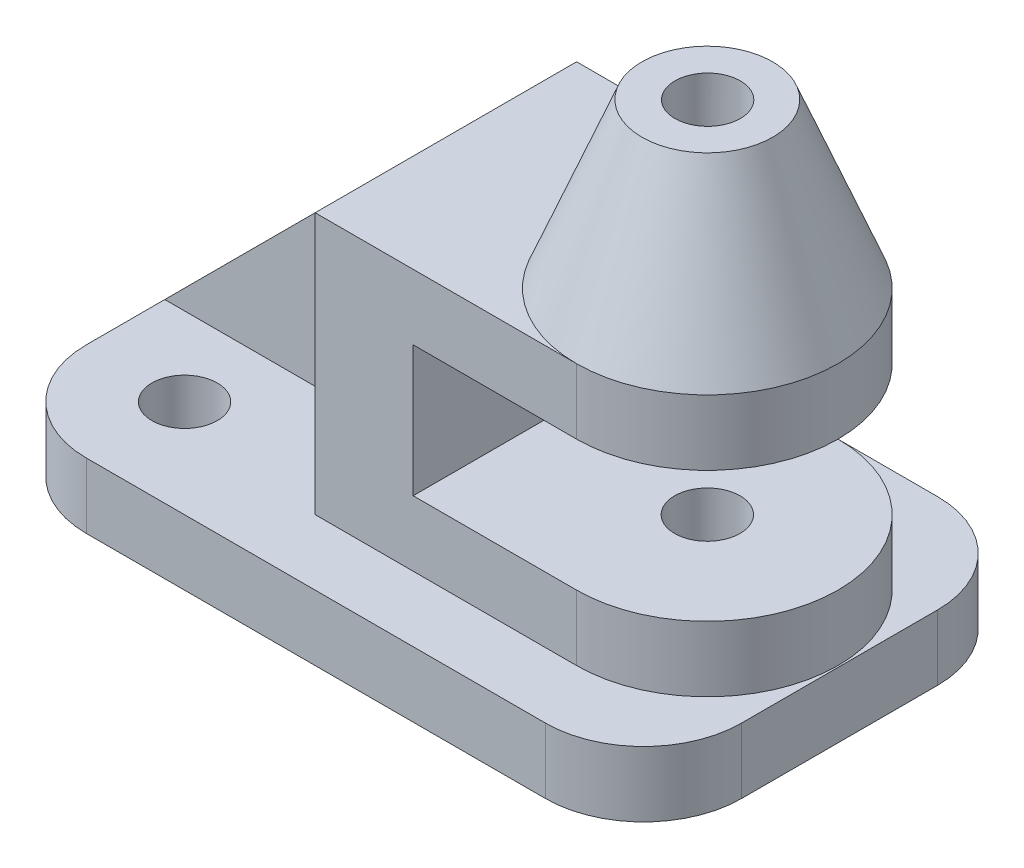
ISO-10303-21;
HEADER;
FILE_DESCRIPTION(('STEP AP214'),'2;1');
FILE_NAME('part.step','',(''),(''),'','','');
FILE_SCHEMA(('AUTOMOTIVE_DESIGN { 1 0 10303 214 1 1 1 1 }'));
ENDSEC;
DATA;
#1=APPLICATION_CONTEXT('core data for automotive mechanical design processes');
#2=APPLICATION_PROTOCOL_DEFINITION('international standard','automotive_design',2000,#1);
#3=PRODUCT_CONTEXT('',#1,'mechanical');
#4=PRODUCT('Part','Part','',(#3));
#5=PRODUCT_RELATED_PRODUCT_CATEGORY('part','',(#4));
#6=PRODUCT_DEFINITION_FORMATION('','',#4);
#7=PRODUCT_DEFINITION_CONTEXT('part definition',#1,'design');
#8=PRODUCT_DEFINITION('design','',#6,#7);
#9=PRODUCT_DEFINITION_SHAPE('','',#8);
#10=(LENGTH_UNIT() NAMED_UNIT(*) SI_UNIT(.MILLI.,.METRE.));
#11=(NAMED_UNIT(*) PLANE_ANGLE_UNIT() SI_UNIT($,.RADIAN.));
#12=(NAMED_UNIT(*) SI_UNIT($,.STERADIAN.) SOLID_ANGLE_UNIT());
#13=UNCERTAINTY_MEASURE_WITH_UNIT(LENGTH_MEASURE(1.E-05),#10,'distance_accuracy_value','');
#14=(GEOMETRIC_REPRESENTATION_CONTEXT(3) GLOBAL_UNCERTAINTY_ASSIGNED_CONTEXT((#13)) GLOBAL_UNIT_ASSIGNED_CONTEXT((#10,
#11,#12)) REPRESENTATION_CONTEXT('',''));
#15=CARTESIAN_POINT('',(0.,0.,0.));
#16=DIRECTION('',(0.,0.,1.));
#17=DIRECTION('',(1.,0.,0.));
#18=AXIS2_PLACEMENT_3D('',#15,#16,#17);
#19=CARTESIAN_POINT('',(-10.1190528471331,50.,20.));
#20=DIRECTION('',(1.,0.,0.));
#21=DIRECTION('',(0.,0.,-1.));
#22=AXIS2_PLACEMENT_3D('',#19,#20,#21);
#23=PLANE('',#22);
#24=DIRECTION('',(0.,-1.,0.));
#25=VECTOR('',#24,1.);
#26=CARTESIAN_POINT('',(-10.1190528471331,50.,-3.));
#27=LINE('',#26,#25);
#28=CARTESIAN_POINT('',(-10.1190528471332,50.,-3.));
#29=VERTEX_POINT('',#28);
#30=CARTESIAN_POINT('',(-10.1190528471331,10.,-3.));
#31=VERTEX_POINT('',#30);
#32=EDGE_CURVE('E353',#29,#31,#27,.T.);
#33=ORIENTED_EDGE('',*,*,#32,.F.);
#34=DIRECTION('',(0.,0.,1.));
#35=VECTOR('',#34,1.);
#36=CARTESIAN_POINT('',(-10.1190528471331,50.,20.));
#37=LINE('',#36,#35);
#38=CARTESIAN_POINT('',(-10.1190528471331,50.,-20.));
#39=VERTEX_POINT('',#38);
#40=EDGE_CURVE('E208',#39,#29,#37,.T.);
#41=ORIENTED_EDGE('',*,*,#40,.F.);
#42=DIRECTION('',(0.,-1.,0.));
#43=VECTOR('',#42,1.);
#44=CARTESIAN_POINT('',(-10.1190528471331,50.,-20.));
#45=LINE('',#44,#43);
#46=CARTESIAN_POINT('',(-10.1190528471331,10.,-20.));
#47=VERTEX_POINT('',#46);
#48=EDGE_CURVE('E239',#39,#47,#45,.T.);
#49=ORIENTED_EDGE('',*,*,#48,.T.);
#50=DIRECTION('',(0.,0.,1.));
#51=VECTOR('',#50,1.);
#52=CARTESIAN_POINT('',(-10.1190528471331,10.,20.));
#53=LINE('',#52,#51);
#54=EDGE_CURVE('E222',#47,#31,#53,.T.);
#55=ORIENTED_EDGE('',*,*,#54,.T.);
#56=EDGE_LOOP('',(#33,#41,#49,#55));
#57=FACE_BOUND('',#56,.T.);
#58=ADVANCED_FACE('F37',(#57),#23,.F.);
#59=CARTESIAN_POINT('',(29.8809471528669,50.,0.));
#60=DIRECTION('',(0.,-1.,0.));
#61=DIRECTION('',(0.,0.,-1.));
#62=AXIS2_PLACEMENT_3D('',#59,#60,#61);
#63=CYLINDRICAL_SURFACE('',#62,20.);
#64=DIRECTION('',(0.,-1.,0.));
#65=VECTOR('',#64,1.);
#66=CARTESIAN_POINT('',(29.8809471528669,50.,20.));
#67=LINE('',#66,#65);
#68=CARTESIAN_POINT('',(29.8809471528669,50.,20.));
#69=VERTEX_POINT('',#68);
#70=CARTESIAN_POINT('',(29.8809471528669,40.,20.));
#71=VERTEX_POINT('',#70);
#72=EDGE_CURVE('E233',#69,#71,#67,.T.);
#73=ORIENTED_EDGE('',*,*,#72,.T.);
#74=CARTESIAN_POINT('',(29.8809471528669,40.,0.));
#75=DIRECTION('',(0.,-1.,0.));
#76=DIRECTION('',(0.,0.,-1.));
#77=AXIS2_PLACEMENT_3D('',#74,#75,#76);
#78=CIRCLE('',#77,20.);
#79=CARTESIAN_POINT('',(29.8809471528669,40.,-20.));
#80=VERTEX_POINT('',#79);
#81=EDGE_CURVE('E315',#80,#71,#78,.T.);
#82=ORIENTED_EDGE('',*,*,#81,.F.);
#83=DIRECTION('',(0.,-1.,0.));
#84=VECTOR('',#83,1.);
#85=CARTESIAN_POINT('',(29.8809471528669,50.,-20.));
#86=LINE('',#85,#84);
#87=CARTESIAN_POINT('',(29.8809471528669,50.,-20.));
#88=VERTEX_POINT('',#87);
#89=EDGE_CURVE('E229',#88,#80,#86,.T.);
#90=ORIENTED_EDGE('',*,*,#89,.F.);
#91=CARTESIAN_POINT('',(29.8809471528669,50.,0.));
#92=DIRECTION('',(0.,1.,0.));
#93=DIRECTION('',(0.,0.,1.));
#94=AXIS2_PLACEMENT_3D('',#91,#92,#93);
#95=CIRCLE('',#94,20.);
#96=EDGE_CURVE('E215',#69,#88,#95,.T.);
#97=ORIENTED_EDGE('',*,*,#96,.F.);
#98=EDGE_LOOP('',(#73,#82,#90,#97));
#99=FACE_BOUND('',#98,.T.);
#100=ADVANCED_FACE('F375',(#99),#63,.T.);
#101=CARTESIAN_POINT('',(29.8809471528668,-9.99999999999999,0.));
#102=DIRECTION('',(0.,1.,0.));
#103=DIRECTION('',(0.,0.,1.));
#104=AXIS2_PLACEMENT_3D('',#101,#102,#103);
#105=CYLINDRICAL_SURFACE('',#104,5.);
#106=CARTESIAN_POINT('',(29.8809471528668,40.,0.));
#107=DIRECTION('',(0.,-1.,0.));
#108=DIRECTION('',(0.,0.,-1.));
#109=AXIS2_PLACEMENT_3D('',#106,#107,#108);
#110=CIRCLE('',#109,5.);
#111=CARTESIAN_POINT('',(29.8809471528668,40.,-5.));
#112=VERTEX_POINT('',#111);
#113=EDGE_CURVE('E313',#112,#112,#110,.F.);
#114=ORIENTED_EDGE('',*,*,#113,.F.);
#115=EDGE_LOOP('',(#114));
#116=FACE_BOUND('',#115,.T.);
#117=CARTESIAN_POINT('',(29.8809471528668,50.,0.));
#118=DIRECTION('',(0.,1.,0.));
#119=DIRECTION('',(0.,0.,1.));
#120=AXIS2_PLACEMENT_3D('',#117,#118,#119);
#121=CIRCLE('',#120,5.);
#122=CARTESIAN_POINT('',(29.9059127762621,50.,4.99993767137636));
#123=VERTEX_POINT('',#122);
#124=CARTESIAN_POINT('',(29.9059127762621,50.,-4.99993767137636));
#125=VERTEX_POINT('',#124);
#126=EDGE_CURVE('E176',#123,#125,#121,.T.);
#127=ORIENTED_EDGE('',*,*,#126,.T.);
#128=EDGE_CURVE('E187',#125,#123,#121,.T.);
#129=ORIENTED_EDGE('',*,*,#128,.T.);
#130=EDGE_LOOP('',(#127,#129));
#131=FACE_BOUND('',#130,.T.);
#132=ADVANCED_FACE('F191',(#116,#131),#105,.F.);
#133=CARTESIAN_POINT('',(-35.1190528471331,10.,-15.));
#134=DIRECTION('',(0.,-1.,0.));
#135=DIRECTION('',(0.,0.,-1.));
#136=AXIS2_PLACEMENT_3D('',#133,#134,#135);
#137=PLANE('',#136);
#138=CARTESIAN_POINT('',(-35.0546536650998,10.,15.0385115163797));
#139=DIRECTION('',(0.,-1.,0.));
#140=DIRECTION('',(0.,0.,-1.));
#141=AXIS2_PLACEMENT_3D('',#138,#139,#140);
#142=CIRCLE('',#141,5.);
#143=CARTESIAN_POINT('',(-35.0546536650998,10.,10.0385115163797));
#144=VERTEX_POINT('',#143);
#145=EDGE_CURVE('E250',#144,#144,#142,.T.);
#146=ORIENTED_EDGE('',*,*,#145,.T.);
#147=EDGE_LOOP('',(#146));
#148=FACE_BOUND('',#147,.T.);
#149=DIRECTION('',(0.,0.,-1.));
#150=VECTOR('',#149,1.);
#151=CARTESIAN_POINT('',(50.1190528471331,10.,15.));
#152=LINE('',#151,#150);
#153=CARTESIAN_POINT('',(50.1190528471331,10.,15.));
#154=VERTEX_POINT('',#153);
#155=CARTESIAN_POINT('',(50.1190528471331,10.,-15.));
#156=VERTEX_POINT('',#155);
#157=EDGE_CURVE('E267',#154,#156,#152,.T.);
#158=ORIENTED_EDGE('',*,*,#157,.T.);
#159=CARTESIAN_POINT('',(35.1190528471331,10.,-15.));
#160=DIRECTION('',(0.,1.,0.));
#161=DIRECTION('',(0.,0.,1.));
#162=AXIS2_PLACEMENT_3D('',#159,#160,#161);
#163=CIRCLE('',#162,15.);
#164=CARTESIAN_POINT('',(35.1190528471331,10.,-30.));
#165=VERTEX_POINT('',#164);
#166=EDGE_CURVE('E265',#156,#165,#163,.T.);
#167=ORIENTED_EDGE('',*,*,#166,.T.);
#168=DIRECTION('',(1.,0.,0.));
#169=VECTOR('',#168,1.);
#170=CARTESIAN_POINT('',(-35.1190528471331,10.,-30.));
#171=LINE('',#170,#169);
#172=CARTESIAN_POINT('',(-35.1190528471331,10.,-30.));
#173=VERTEX_POINT('',#172);
#174=EDGE_CURVE('E262',#173,#165,#171,.T.);
#175=ORIENTED_EDGE('',*,*,#174,.F.);
#176=CARTESIAN_POINT('',(-35.1190528471331,10.,-15.));
#177=DIRECTION('',(0.,-1.,0.));
#178=DIRECTION('',(0.,0.,-1.));
#179=AXIS2_PLACEMENT_3D('',#176,#177,#178);
#180=CIRCLE('',#179,15.);
#181=CARTESIAN_POINT('',(-50.1190528471331,10.,-15.));
#182=VERTEX_POINT('',#181);
#183=EDGE_CURVE('E258',#182,#173,#180,.T.);
#184=ORIENTED_EDGE('',*,*,#183,.F.);
#185=DIRECTION('',(0.,0.,-1.));
#186=VECTOR('',#185,1.);
#187=CARTESIAN_POINT('',(-50.1190528471331,10.,15.));
#188=LINE('',#187,#186);
#189=CARTESIAN_POINT('',(-50.1190528471331,10.,-3.));
#190=VERTEX_POINT('',#189);
#191=EDGE_CURVE('E259',#190,#182,#188,.T.);
#192=ORIENTED_EDGE('',*,*,#191,.F.);
#193=DIRECTION('',(-1.,0.,0.));
#194=VECTOR('',#193,1.);
#195=CARTESIAN_POINT('',(-35.1190528471331,10.,-3.));
#196=LINE('',#195,#194);
#197=EDGE_CURVE('E351',#31,#190,#196,.T.);
#198=ORIENTED_EDGE('',*,*,#197,.F.);
#199=ORIENTED_EDGE('',*,*,#54,.F.);
#200=DIRECTION('',(-1.,0.,0.));
#201=VECTOR('',#200,1.);
#202=CARTESIAN_POINT('',(-10.1190528471331,10.,-20.));
#203=LINE('',#202,#201);
#204=CARTESIAN_POINT('',(29.8809471528669,10.,-20.));
#205=VERTEX_POINT('',#204);
#206=EDGE_CURVE('E202',#205,#47,#203,.T.);
#207=ORIENTED_EDGE('',*,*,#206,.F.);
#208=CARTESIAN_POINT('',(29.8809471528669,10.,0.));
#209=DIRECTION('',(0.,1.,0.));
#210=DIRECTION('',(0.,0.,1.));
#211=AXIS2_PLACEMENT_3D('',#208,#209,#210);
#212=CIRCLE('',#211,20.);
#213=CARTESIAN_POINT('',(29.8809471528669,10.,20.));
#214=VERTEX_POINT('',#213);
#215=EDGE_CURVE('E207',#214,#205,#212,.T.);
#216=ORIENTED_EDGE('',*,*,#215,.F.);
#217=DIRECTION('',(1.,0.,0.));
#218=VECTOR('',#217,1.);
#219=CARTESIAN_POINT('',(-10.1190528471331,10.,20.));
#220=LINE('',#219,#218);
#221=CARTESIAN_POINT('',(-10.1190528471331,10.,20.));
#222=VERTEX_POINT('',#221);
#223=EDGE_CURVE('E225',#222,#214,#220,.T.);
#224=ORIENTED_EDGE('',*,*,#223,.F.);
#225=CARTESIAN_POINT('',(-10.1190528471331,10.,3.));
#226=VERTEX_POINT('',#225);
#227=EDGE_CURVE('E221',#226,#222,#53,.T.);
#228=ORIENTED_EDGE('',*,*,#227,.F.);
#229=DIRECTION('',(-1.,0.,0.));
#230=VECTOR('',#229,1.);
#231=CARTESIAN_POINT('',(-35.1190528471331,10.,3.));
#232=LINE('',#231,#230);
#233=CARTESIAN_POINT('',(-50.1190528471331,10.,3.));
#234=VERTEX_POINT('',#233);
#235=EDGE_CURVE('E345',#226,#234,#232,.T.);
#236=ORIENTED_EDGE('',*,*,#235,.T.);
#237=CARTESIAN_POINT('',(-50.1190528471331,10.,15.));
#238=VERTEX_POINT('',#237);
#239=EDGE_CURVE('E255',#238,#234,#188,.T.);
#240=ORIENTED_EDGE('',*,*,#239,.F.);
#241=CARTESIAN_POINT('',(-35.1190528471331,10.,15.));
#242=DIRECTION('',(0.,-1.,0.));
#243=DIRECTION('',(0.,0.,-1.));
#244=AXIS2_PLACEMENT_3D('',#241,#242,#243);
#245=CIRCLE('',#244,15.);
#246=CARTESIAN_POINT('',(-35.1190528471331,10.,30.));
#247=VERTEX_POINT('',#246);
#248=EDGE_CURVE('E273',#247,#238,#245,.T.);
#249=ORIENTED_EDGE('',*,*,#248,.F.);
#250=DIRECTION('',(1.,0.,0.));
#251=VECTOR('',#250,1.);
#252=CARTESIAN_POINT('',(-35.1190528471331,10.,30.));
#253=LINE('',#252,#251);
#254=CARTESIAN_POINT('',(35.1190528471331,10.,30.));
#255=VERTEX_POINT('',#254);
#256=EDGE_CURVE('E271',#247,#255,#253,.T.);
#257=ORIENTED_EDGE('',*,*,#256,.T.);
#258=CARTESIAN_POINT('',(35.1190528471331,10.,15.));
#259=DIRECTION('',(0.,1.,0.));
#260=DIRECTION('',(0.,0.,1.));
#261=AXIS2_PLACEMENT_3D('',#258,#259,#260);
#262=CIRCLE('',#261,15.);
#263=EDGE_CURVE('E269',#255,#154,#262,.T.);
#264=ORIENTED_EDGE('',*,*,#263,.T.);
#265=EDGE_LOOP('',(#158,#167,#175,#184,#192,#198,#199,#207,#216,#224,#228,#236,#240,#249,#257,#264));
#266=FACE_BOUND('',#265,.T.);
#267=CARTESIAN_POINT('',(-35.0546536650998,10.,-15.0385115163797));
#268=DIRECTION('',(0.,1.,0.));
#269=DIRECTION('',(0.,0.,1.));
#270=AXIS2_PLACEMENT_3D('',#267,#268,#269);
#271=CIRCLE('',#270,5.);
#272=CARTESIAN_POINT('',(-35.0546536650998,10.,-10.0385115163797));
#273=VERTEX_POINT('',#272);
#274=EDGE_CURVE('E247',#273,#273,#271,.T.);
#275=ORIENTED_EDGE('',*,*,#274,.F.);
#276=EDGE_LOOP('',(#275));
#277=FACE_BOUND('',#276,.T.);
#278=ADVANCED_FACE('F396',(#148,#266,#277),#137,.F.);
#279=CARTESIAN_POINT('',(-35.1190528471331,0.,-15.));
#280=DIRECTION('',(0.,-1.,0.));
#281=DIRECTION('',(0.,0.,-1.));
#282=AXIS2_PLACEMENT_3D('',#279,#280,#281);
#283=PLANE('',#282);
#284=CARTESIAN_POINT('',(29.8809471528668,0.,0.));
#285=DIRECTION('',(0.,-1.,0.));
#286=DIRECTION('',(0.,0.,-1.));
#287=AXIS2_PLACEMENT_3D('',#284,#285,#286);
#288=CIRCLE('',#287,5.);
#289=CARTESIAN_POINT('',(29.8809471528668,0.,-5.));
#290=VERTEX_POINT('',#289);
#291=EDGE_CURVE('E199',#290,#290,#288,.T.);
#292=ORIENTED_EDGE('',*,*,#291,.F.);
#293=EDGE_LOOP('',(#292));
#294=FACE_BOUND('',#293,.T.);
#295=CARTESIAN_POINT('',(35.1190528471331,0.,-15.));
#296=DIRECTION('',(0.,1.,0.));
#297=DIRECTION('',(0.,0.,1.));
#298=AXIS2_PLACEMENT_3D('',#295,#296,#297);
#299=CIRCLE('',#298,15.);
#300=CARTESIAN_POINT('',(50.1190528471331,0.,-15.));
#301=VERTEX_POINT('',#300);
#302=CARTESIAN_POINT('',(35.1190528471331,0.,-30.));
#303=VERTEX_POINT('',#302);
#304=EDGE_CURVE('E284',#301,#303,#299,.T.);
#305=ORIENTED_EDGE('',*,*,#304,.F.);
#306=DIRECTION('',(0.,0.,-1.));
#307=VECTOR('',#306,1.);
#308=CARTESIAN_POINT('',(50.1190528471331,0.,15.));
#309=LINE('',#308,#307);
#310=CARTESIAN_POINT('',(50.1190528471331,0.,15.));
#311=VERTEX_POINT('',#310);
#312=EDGE_CURVE('E287',#311,#301,#309,.T.);
#313=ORIENTED_EDGE('',*,*,#312,.F.);
#314=CARTESIAN_POINT('',(35.1190528471331,0.,15.));
#315=DIRECTION('',(0.,1.,0.));
#316=DIRECTION('',(0.,0.,1.));
#317=AXIS2_PLACEMENT_3D('',#314,#315,#316);
#318=CIRCLE('',#317,15.);
#319=CARTESIAN_POINT('',(35.1190528471331,0.,30.));
#320=VERTEX_POINT('',#319);
#321=EDGE_CURVE('E289',#320,#311,#318,.T.);
#322=ORIENTED_EDGE('',*,*,#321,.F.);
#323=DIRECTION('',(1.,0.,0.));
#324=VECTOR('',#323,1.);
#325=CARTESIAN_POINT('',(-35.1190528471331,0.,30.));
#326=LINE('',#325,#324);
#327=CARTESIAN_POINT('',(-35.1190528471331,0.,30.));
#328=VERTEX_POINT('',#327);
#329=EDGE_CURVE('E291',#328,#320,#326,.T.);
#330=ORIENTED_EDGE('',*,*,#329,.F.);
#331=CARTESIAN_POINT('',(-35.1190528471331,0.,15.));
#332=DIRECTION('',(0.,-1.,0.));
#333=DIRECTION('',(0.,0.,-1.));
#334=AXIS2_PLACEMENT_3D('',#331,#332,#333);
#335=CIRCLE('',#334,15.);
#336=CARTESIAN_POINT('',(-50.1190528471331,0.,15.));
#337=VERTEX_POINT('',#336);
#338=EDGE_CURVE('E293',#328,#337,#335,.T.);
#339=ORIENTED_EDGE('',*,*,#338,.T.);
#340=DIRECTION('',(0.,0.,-1.));
#341=VECTOR('',#340,1.);
#342=CARTESIAN_POINT('',(-50.1190528471331,0.,15.));
#343=LINE('',#342,#341);
#344=CARTESIAN_POINT('',(-50.1190528471331,0.,-15.));
#345=VERTEX_POINT('',#344);
#346=EDGE_CURVE('E246',#337,#345,#343,.T.);
#347=ORIENTED_EDGE('',*,*,#346,.T.);
#348=CARTESIAN_POINT('',(-35.1190528471331,0.,-15.));
#349=DIRECTION('',(0.,-1.,0.));
#350=DIRECTION('',(0.,0.,-1.));
#351=AXIS2_PLACEMENT_3D('',#348,#349,#350);
#352=CIRCLE('',#351,15.);
#353=CARTESIAN_POINT('',(-35.1190528471331,0.,-30.));
#354=VERTEX_POINT('',#353);
#355=EDGE_CURVE('E278',#345,#354,#352,.T.);
#356=ORIENTED_EDGE('',*,*,#355,.T.);
#357=DIRECTION('',(1.,0.,0.));
#358=VECTOR('',#357,1.);
#359=CARTESIAN_POINT('',(-35.1190528471331,0.,-30.));
#360=LINE('',#359,#358);
#361=EDGE_CURVE('E281',#354,#303,#360,.T.);
#362=ORIENTED_EDGE('',*,*,#361,.T.);
#363=EDGE_LOOP('',(#305,#313,#322,#330,#339,#347,#356,#362));
#364=FACE_BOUND('',#363,.T.);
#365=CARTESIAN_POINT('',(-35.0546536650998,0.,15.0385115163797));
#366=DIRECTION('',(0.,-1.,0.));
#367=DIRECTION('',(0.,0.,-1.));
#368=AXIS2_PLACEMENT_3D('',#365,#366,#367);
#369=CIRCLE('',#368,5.);
#370=CARTESIAN_POINT('',(-35.0546536650998,0.,10.0385115163797));
#371=VERTEX_POINT('',#370);
#372=EDGE_CURVE('E242',#371,#371,#369,.T.);
#373=ORIENTED_EDGE('',*,*,#372,.F.);
#374=EDGE_LOOP('',(#373));
#375=FACE_BOUND('',#374,.T.);
#376=CARTESIAN_POINT('',(-35.0546536650998,0.,-15.0385115163797));
#377=DIRECTION('',(0.,1.,0.));
#378=DIRECTION('',(0.,0.,1.));
#379=AXIS2_PLACEMENT_3D('',#376,#377,#378);
#380=CIRCLE('',#379,5.);
#381=CARTESIAN_POINT('',(-35.0546536650998,0.,-10.0385115163797));
#382=VERTEX_POINT('',#381);
#383=EDGE_CURVE('E243',#382,#382,#380,.T.);
#384=ORIENTED_EDGE('',*,*,#383,.T.);
#385=EDGE_LOOP('',(#384));
#386=FACE_BOUND('',#385,.T.);
#387=ADVANCED_FACE('F454',(#294,#364,#375,#386),#283,.T.);
#388=CARTESIAN_POINT('',(-50.1190528471331,10.,15.));
#389=DIRECTION('',(-1.,0.,0.));
#390=DIRECTION('',(0.,0.,1.));
#391=AXIS2_PLACEMENT_3D('',#388,#389,#390);
#392=PLANE('',#391);
#393=ORIENTED_EDGE('',*,*,#239,.T.);
#394=DIRECTION('',(0.,0.,1.));
#395=VECTOR('',#394,1.);
#396=CARTESIAN_POINT('',(-50.1190528471331,10.,15.));
#397=LINE('',#396,#395);
#398=EDGE_CURVE('E336',#234,#190,#397,.F.);
#399=ORIENTED_EDGE('',*,*,#398,.T.);
#400=ORIENTED_EDGE('',*,*,#191,.T.);
#401=DIRECTION('',(0.,-1.,0.));
#402=VECTOR('',#401,1.);
#403=CARTESIAN_POINT('',(-50.1190528471331,10.,-15.));
#404=LINE('',#403,#402);
#405=EDGE_CURVE('E276',#182,#345,#404,.T.);
#406=ORIENTED_EDGE('',*,*,#405,.T.);
#407=ORIENTED_EDGE('',*,*,#346,.F.);
#408=DIRECTION('',(0.,-1.,0.));
#409=VECTOR('',#408,1.);
#410=CARTESIAN_POINT('',(-50.1190528471331,10.,15.));
#411=LINE('',#410,#409);
#412=EDGE_CURVE('E46',#238,#337,#411,.T.);
#413=ORIENTED_EDGE('',*,*,#412,.F.);
#414=EDGE_LOOP('',(#393,#399,#400,#406,#407,#413));
#415=FACE_BOUND('',#414,.T.);
#416=ADVANCED_FACE('F39',(#415),#392,.T.);
#417=CARTESIAN_POINT('',(-35.1190528471331,10.,15.));
#418=DIRECTION('',(0.,-1.,0.));
#419=DIRECTION('',(0.,0.,-1.));
#420=AXIS2_PLACEMENT_3D('',#417,#418,#419);
#421=CYLINDRICAL_SURFACE('',#420,15.);
#422=ORIENTED_EDGE('',*,*,#338,.F.);
#423=DIRECTION('',(0.,-1.,0.));
#424=VECTOR('',#423,1.);
#425=CARTESIAN_POINT('',(-35.1190528471331,10.,30.));
#426=LINE('',#425,#424);
#427=EDGE_CURVE('E297',#247,#328,#426,.T.);
#428=ORIENTED_EDGE('',*,*,#427,.F.);
#429=ORIENTED_EDGE('',*,*,#248,.T.);
#430=ORIENTED_EDGE('',*,*,#412,.T.);
#431=EDGE_LOOP('',(#422,#428,#429,#430));
#432=FACE_BOUND('',#431,.T.);
#433=ADVANCED_FACE('F459',(#432),#421,.T.);
#434=CARTESIAN_POINT('',(-35.1190528471331,10.,30.));
#435=DIRECTION('',(0.,0.,-1.));
#436=DIRECTION('',(-1.,0.,0.));
#437=AXIS2_PLACEMENT_3D('',#434,#435,#436);
#438=PLANE('',#437);
#439=ORIENTED_EDGE('',*,*,#329,.T.);
#440=DIRECTION('',(0.,-1.,0.));
#441=VECTOR('',#440,1.);
#442=CARTESIAN_POINT('',(35.1190528471331,10.,30.));
#443=LINE('',#442,#441);
#444=EDGE_CURVE('E299',#255,#320,#443,.T.);
#445=ORIENTED_EDGE('',*,*,#444,.F.);
#446=ORIENTED_EDGE('',*,*,#256,.F.);
#447=ORIENTED_EDGE('',*,*,#427,.T.);
#448=EDGE_LOOP('',(#439,#445,#446,#447));
#449=FACE_BOUND('',#448,.T.);
#450=ADVANCED_FACE('F462',(#449),#438,.F.);
#451=CARTESIAN_POINT('',(35.1190528471331,10.,15.));
#452=DIRECTION('',(0.,-1.,0.));
#453=DIRECTION('',(0.,0.,-1.));
#454=AXIS2_PLACEMENT_3D('',#451,#452,#453);
#455=CYLINDRICAL_SURFACE('',#454,15.);
#456=ORIENTED_EDGE('',*,*,#321,.T.);
#457=DIRECTION('',(0.,-1.,0.));
#458=VECTOR('',#457,1.);
#459=CARTESIAN_POINT('',(50.1190528471331,10.,15.));
#460=LINE('',#459,#458);
#461=EDGE_CURVE('E302',#154,#311,#460,.T.);
#462=ORIENTED_EDGE('',*,*,#461,.F.);
#463=ORIENTED_EDGE('',*,*,#263,.F.);
#464=ORIENTED_EDGE('',*,*,#444,.T.);
#465=EDGE_LOOP('',(#456,#462,#463,#464));
#466=FACE_BOUND('',#465,.T.);
#467=ADVANCED_FACE('F466',(#466),#455,.T.);
#468=CARTESIAN_POINT('',(50.1190528471331,10.,15.));
#469=DIRECTION('',(-1.,0.,0.));
#470=DIRECTION('',(0.,0.,1.));
#471=AXIS2_PLACEMENT_3D('',#468,#469,#470);
#472=PLANE('',#471);
#473=ORIENTED_EDGE('',*,*,#312,.T.);
#474=DIRECTION('',(0.,-1.,0.));
#475=VECTOR('',#474,1.);
#476=CARTESIAN_POINT('',(50.1190528471331,10.,-15.));
#477=LINE('',#476,#475);
#478=EDGE_CURVE('E305',#156,#301,#477,.T.);
#479=ORIENTED_EDGE('',*,*,#478,.F.);
#480=ORIENTED_EDGE('',*,*,#157,.F.);
#481=ORIENTED_EDGE('',*,*,#461,.T.);
#482=EDGE_LOOP('',(#473,#479,#480,#481));
#483=FACE_BOUND('',#482,.T.);
#484=ADVANCED_FACE('F470',(#483),#472,.F.);
#485=CARTESIAN_POINT('',(35.1190528471331,10.,-15.));
#486=DIRECTION('',(0.,-1.,0.));
#487=DIRECTION('',(0.,0.,-1.));
#488=AXIS2_PLACEMENT_3D('',#485,#486,#487);
#489=CYLINDRICAL_SURFACE('',#488,15.);
#490=ORIENTED_EDGE('',*,*,#304,.T.);
#491=DIRECTION('',(0.,-1.,0.));
#492=VECTOR('',#491,1.);
#493=CARTESIAN_POINT('',(35.1190528471331,10.,-30.));
#494=LINE('',#493,#492);
#495=EDGE_CURVE('E308',#165,#303,#494,.T.);
#496=ORIENTED_EDGE('',*,*,#495,.F.);
#497=ORIENTED_EDGE('',*,*,#166,.F.);
#498=ORIENTED_EDGE('',*,*,#478,.T.);
#499=EDGE_LOOP('',(#490,#496,#497,#498));
#500=FACE_BOUND('',#499,.T.);
#501=ADVANCED_FACE('F474',(#500),#489,.T.);
#502=CARTESIAN_POINT('',(-35.1190528471331,10.,-30.));
#503=DIRECTION('',(0.,0.,-1.));
#504=DIRECTION('',(-1.,0.,0.));
#505=AXIS2_PLACEMENT_3D('',#502,#503,#504);
#506=PLANE('',#505);
#507=ORIENTED_EDGE('',*,*,#361,.F.);
#508=DIRECTION('',(0.,-1.,0.));
#509=VECTOR('',#508,1.);
#510=CARTESIAN_POINT('',(-35.1190528471331,10.,-30.));
#511=LINE('',#510,#509);
#512=EDGE_CURVE('E310',#173,#354,#511,.T.);
#513=ORIENTED_EDGE('',*,*,#512,.F.);
#514=ORIENTED_EDGE('',*,*,#174,.T.);
#515=ORIENTED_EDGE('',*,*,#495,.T.);
#516=EDGE_LOOP('',(#507,#513,#514,#515));
#517=FACE_BOUND('',#516,.T.);
#518=ADVANCED_FACE('F478',(#517),#506,.T.);
#519=CARTESIAN_POINT('',(-35.1190528471331,10.,-15.));
#520=DIRECTION('',(0.,-1.,0.));
#521=DIRECTION('',(0.,0.,-1.));
#522=AXIS2_PLACEMENT_3D('',#519,#520,#521);
#523=CYLINDRICAL_SURFACE('',#522,15.);
#524=ORIENTED_EDGE('',*,*,#355,.F.);
#525=ORIENTED_EDGE('',*,*,#405,.F.);
#526=ORIENTED_EDGE('',*,*,#183,.T.);
#527=ORIENTED_EDGE('',*,*,#512,.T.);
#528=EDGE_LOOP('',(#524,#525,#526,#527));
#529=FACE_BOUND('',#528,.T.);
#530=ADVANCED_FACE('F450',(#529),#523,.T.);
#531=CARTESIAN_POINT('',(-35.0546536650998,0.,15.0385115163797));
#532=DIRECTION('',(0.,1.,0.));
#533=DIRECTION('',(0.,0.,1.));
#534=AXIS2_PLACEMENT_3D('',#531,#532,#533);
#535=CYLINDRICAL_SURFACE('',#534,5.);
#536=ORIENTED_EDGE('',*,*,#372,.T.);
#537=EDGE_LOOP('',(#536));
#538=FACE_BOUND('',#537,.T.);
#539=ORIENTED_EDGE('',*,*,#145,.F.);
#540=EDGE_LOOP('',(#539));
#541=FACE_BOUND('',#540,.T.);
#542=ADVANCED_FACE('F444',(#538,#541),#535,.F.);
#543=CARTESIAN_POINT('',(-35.0546536650998,0.,-15.0385115163797));
#544=DIRECTION('',(0.,1.,0.));
#545=DIRECTION('',(0.,0.,1.));
#546=AXIS2_PLACEMENT_3D('',#543,#544,#545);
#547=CYLINDRICAL_SURFACE('',#546,5.);
#548=ORIENTED_EDGE('',*,*,#383,.F.);
#549=EDGE_LOOP('',(#548));
#550=FACE_BOUND('',#549,.T.);
#551=ORIENTED_EDGE('',*,*,#274,.T.);
#552=EDGE_LOOP('',(#551));
#553=FACE_BOUND('',#552,.T.);
#554=ADVANCED_FACE('F440',(#550,#553),#547,.F.);
#555=CARTESIAN_POINT('',(-10.1190528471331,50.,-20.));
#556=DIRECTION('',(0.,0.,1.));
#557=DIRECTION('',(1.,0.,0.));
#558=AXIS2_PLACEMENT_3D('',#555,#556,#557);
#559=PLANE('',#558);
#560=DIRECTION('',(0.,-1.,0.));
#561=VECTOR('',#560,1.);
#562=CARTESIAN_POINT('',(4.88094715286686,40.,-20.));
#563=LINE('',#562,#561);
#564=CARTESIAN_POINT('',(4.88094715286686,40.,-20.));
#565=VERTEX_POINT('',#564);
#566=CARTESIAN_POINT('',(4.88094715286686,20.,-20.));
#567=VERTEX_POINT('',#566);
#568=EDGE_CURVE('E325',#565,#567,#563,.T.);
#569=ORIENTED_EDGE('',*,*,#568,.T.);
#570=DIRECTION('',(1.,0.,0.));
#571=VECTOR('',#570,1.);
#572=CARTESIAN_POINT('',(4.88094715286686,20.,-20.));
#573=LINE('',#572,#571);
#574=CARTESIAN_POINT('',(29.8809471528669,20.,-20.));
#575=VERTEX_POINT('',#574);
#576=EDGE_CURVE('E330',#567,#575,#573,.T.);
#577=ORIENTED_EDGE('',*,*,#576,.T.);
#578=EDGE_CURVE('E218',#575,#205,#86,.T.);
#579=ORIENTED_EDGE('',*,*,#578,.T.);
#580=ORIENTED_EDGE('',*,*,#206,.T.);
#581=ORIENTED_EDGE('',*,*,#48,.F.);
#582=DIRECTION('',(-1.,0.,0.));
#583=VECTOR('',#582,1.);
#584=CARTESIAN_POINT('',(-10.1190528471331,50.,-20.));
#585=LINE('',#584,#583);
#586=EDGE_CURVE('E203',#88,#39,#585,.T.);
#587=ORIENTED_EDGE('',*,*,#586,.F.);
#588=ORIENTED_EDGE('',*,*,#89,.T.);
#589=DIRECTION('',(1.,0.,0.));
#590=VECTOR('',#589,1.);
#591=CARTESIAN_POINT('',(4.88094715286686,40.,-20.));
#592=LINE('',#591,#590);
#593=EDGE_CURVE('E339',#565,#80,#592,.T.);
#594=ORIENTED_EDGE('',*,*,#593,.F.);
#595=EDGE_LOOP('',(#569,#577,#579,#580,#581,#587,#588,#594));
#596=FACE_BOUND('',#595,.T.);
#597=ADVANCED_FACE('F404',(#596),#559,.F.);
#598=CARTESIAN_POINT('',(-10.1190528471331,50.,3.));
#599=VERTEX_POINT('',#598);
#600=CARTESIAN_POINT('',(-10.1190528471331,50.,20.));
#601=VERTEX_POINT('',#600);
#602=EDGE_CURVE('E206',#599,#601,#37,.T.);
#603=ORIENTED_EDGE('',*,*,#602,.F.);
#604=DIRECTION('',(0.,-1.,0.));
#605=VECTOR('',#604,1.);
#606=CARTESIAN_POINT('',(-10.1190528471331,50.,3.));
#607=LINE('',#606,#605);
#608=EDGE_CURVE('E348',#599,#226,#607,.T.);
#609=ORIENTED_EDGE('',*,*,#608,.T.);
#610=ORIENTED_EDGE('',*,*,#227,.T.);
#611=DIRECTION('',(0.,-1.,0.));
#612=VECTOR('',#611,1.);
#613=CARTESIAN_POINT('',(-10.1190528471331,50.,20.));
#614=LINE('',#613,#612);
#615=EDGE_CURVE('E236',#601,#222,#614,.T.);
#616=ORIENTED_EDGE('',*,*,#615,.F.);
#617=EDGE_LOOP('',(#603,#609,#610,#616));
#618=FACE_BOUND('',#617,.T.);
#619=ADVANCED_FACE('F390',(#618),#23,.F.);
#620=CARTESIAN_POINT('',(-10.1190528471331,50.,20.));
#621=DIRECTION('',(0.,0.,-1.));
#622=DIRECTION('',(-1.,0.,0.));
#623=AXIS2_PLACEMENT_3D('',#620,#621,#622);
#624=PLANE('',#623);
#625=CARTESIAN_POINT('',(29.8809471528669,20.,20.));
#626=VERTEX_POINT('',#625);
#627=EDGE_CURVE('E232',#626,#214,#67,.T.);
#628=ORIENTED_EDGE('',*,*,#627,.F.);
#629=DIRECTION('',(1.,0.,0.));
#630=VECTOR('',#629,1.);
#631=CARTESIAN_POINT('',(4.88094715286686,20.,20.));
#632=LINE('',#631,#630);
#633=CARTESIAN_POINT('',(4.88094715286686,20.,20.));
#634=VERTEX_POINT('',#633);
#635=EDGE_CURVE('E334',#634,#626,#632,.T.);
#636=ORIENTED_EDGE('',*,*,#635,.F.);
#637=DIRECTION('',(0.,-1.,0.));
#638=VECTOR('',#637,1.);
#639=CARTESIAN_POINT('',(4.88094715286686,40.,20.));
#640=LINE('',#639,#638);
#641=CARTESIAN_POINT('',(4.88094715286686,40.,20.));
#642=VERTEX_POINT('',#641);
#643=EDGE_CURVE('E328',#642,#634,#640,.T.);
#644=ORIENTED_EDGE('',*,*,#643,.F.);
#645=DIRECTION('',(1.,0.,0.));
#646=VECTOR('',#645,1.);
#647=CARTESIAN_POINT('',(4.88094715286686,40.,20.));
#648=LINE('',#647,#646);
#649=EDGE_CURVE('E331',#642,#71,#648,.T.);
#650=ORIENTED_EDGE('',*,*,#649,.T.);
#651=ORIENTED_EDGE('',*,*,#72,.F.);
#652=DIRECTION('',(1.,0.,0.));
#653=VECTOR('',#652,1.);
#654=CARTESIAN_POINT('',(-10.1190528471331,50.,20.));
#655=LINE('',#654,#653);
#656=EDGE_CURVE('E211',#601,#69,#655,.T.);
#657=ORIENTED_EDGE('',*,*,#656,.F.);
#658=ORIENTED_EDGE('',*,*,#615,.T.);
#659=ORIENTED_EDGE('',*,*,#223,.T.);
#660=EDGE_LOOP('',(#628,#636,#644,#650,#651,#657,#658,#659));
#661=FACE_BOUND('',#660,.T.);
#662=ADVANCED_FACE('F381',(#661),#624,.F.);
#663=ORIENTED_EDGE('',*,*,#215,.T.);
#664=ORIENTED_EDGE('',*,*,#578,.F.);
#665=CARTESIAN_POINT('',(29.8809471528669,20.,0.));
#666=DIRECTION('',(0.,-1.,0.));
#667=DIRECTION('',(0.,0.,-1.));
#668=AXIS2_PLACEMENT_3D('',#665,#666,#667);
#669=CIRCLE('',#668,20.);
#670=EDGE_CURVE('E197',#575,#626,#669,.T.);
#671=ORIENTED_EDGE('',*,*,#670,.T.);
#672=ORIENTED_EDGE('',*,*,#627,.T.);
#673=EDGE_LOOP('',(#663,#664,#671,#672));
#674=FACE_BOUND('',#673,.T.);
#675=ADVANCED_FACE('F402',(#674),#63,.T.);
#676=CARTESIAN_POINT('',(29.8809471528669,50.,0.));
#677=DIRECTION('',(0.,1.,0.));
#678=DIRECTION('',(0.,0.,1.));
#679=AXIS2_PLACEMENT_3D('',#676,#677,#678);
#680=PLANE('',#679);
#681=CARTESIAN_POINT('',(29.8809471528669,50.,0.));
#682=DIRECTION('',(0.,1.,0.));
#683=DIRECTION('',(0.,0.,1.));
#684=AXIS2_PLACEMENT_3D('',#681,#682,#683);
#685=CIRCLE('',#684,20.);
#686=EDGE_CURVE('E11',#88,#69,#685,.T.);
#687=ORIENTED_EDGE('',*,*,#686,.F.);
#688=ORIENTED_EDGE('',*,*,#586,.T.);
#689=ORIENTED_EDGE('',*,*,#40,.T.);
#690=EDGE_CURVE('E212',#29,#599,#37,.T.);
#691=ORIENTED_EDGE('',*,*,#690,.T.);
#692=ORIENTED_EDGE('',*,*,#602,.T.);
#693=ORIENTED_EDGE('',*,*,#656,.T.);
#694=EDGE_LOOP('',(#687,#688,#689,#691,#692,#693));
#695=FACE_BOUND('',#694,.T.);
#696=ADVANCED_FACE('F385',(#695),#680,.T.);
#697=ORIENTED_EDGE('',*,*,#291,.T.);
#698=EDGE_LOOP('',(#697));
#699=FACE_BOUND('',#698,.T.);
#700=CARTESIAN_POINT('',(29.8809471528668,20.,0.));
#701=DIRECTION('',(0.,-1.,0.));
#702=DIRECTION('',(0.,0.,-1.));
#703=AXIS2_PLACEMENT_3D('',#700,#701,#702);
#704=CIRCLE('',#703,5.);
#705=CARTESIAN_POINT('',(29.8809471528668,20.,-5.));
#706=VERTEX_POINT('',#705);
#707=EDGE_CURVE('E41',#706,#706,#704,.F.);
#708=ORIENTED_EDGE('',*,*,#707,.T.);
#709=EDGE_LOOP('',(#708));
#710=FACE_BOUND('',#709,.T.);
#711=ADVANCED_FACE('F412',(#699,#710),#105,.F.);
#712=CARTESIAN_POINT('',(4.88094715286686,20.,-20.));
#713=DIRECTION('',(0.,-1.,0.));
#714=DIRECTION('',(0.,0.,-1.));
#715=AXIS2_PLACEMENT_3D('',#712,#713,#714);
#716=PLANE('',#715);
#717=ORIENTED_EDGE('',*,*,#707,.F.);
#718=EDGE_LOOP('',(#717));
#719=FACE_BOUND('',#718,.T.);
#720=ORIENTED_EDGE('',*,*,#635,.T.);
#721=ORIENTED_EDGE('',*,*,#670,.F.);
#722=ORIENTED_EDGE('',*,*,#576,.F.);
#723=DIRECTION('',(0.,0.,1.));
#724=VECTOR('',#723,1.);
#725=CARTESIAN_POINT('',(4.88094715286686,20.,-20.));
#726=LINE('',#725,#724);
#727=EDGE_CURVE('E316',#567,#634,#726,.T.);
#728=ORIENTED_EDGE('',*,*,#727,.T.);
#729=EDGE_LOOP('',(#720,#721,#722,#728));
#730=FACE_BOUND('',#729,.T.);
#731=ADVANCED_FACE('F408',(#719,#730),#716,.F.);
#732=CARTESIAN_POINT('',(4.88094715286686,40.,-20.));
#733=DIRECTION('',(0.,-1.,0.));
#734=DIRECTION('',(0.,0.,-1.));
#735=AXIS2_PLACEMENT_3D('',#732,#733,#734);
#736=PLANE('',#735);
#737=ORIENTED_EDGE('',*,*,#113,.T.);
#738=EDGE_LOOP('',(#737));
#739=FACE_BOUND('',#738,.T.);
#740=ORIENTED_EDGE('',*,*,#81,.T.);
#741=ORIENTED_EDGE('',*,*,#649,.F.);
#742=DIRECTION('',(0.,0.,1.));
#743=VECTOR('',#742,1.);
#744=CARTESIAN_POINT('',(4.88094715286686,40.,-20.));
#745=LINE('',#744,#743);
#746=EDGE_CURVE('E319',#565,#642,#745,.T.);
#747=ORIENTED_EDGE('',*,*,#746,.F.);
#748=ORIENTED_EDGE('',*,*,#593,.T.);
#749=EDGE_LOOP('',(#740,#741,#747,#748));
#750=FACE_BOUND('',#749,.T.);
#751=ADVANCED_FACE('F415',(#739,#750),#736,.T.);
#752=CARTESIAN_POINT('',(4.88094715286686,40.,-20.));
#753=DIRECTION('',(-1.,0.,0.));
#754=DIRECTION('',(0.,-1.,0.));
#755=AXIS2_PLACEMENT_3D('',#752,#753,#754);
#756=PLANE('',#755);
#757=ORIENTED_EDGE('',*,*,#643,.T.);
#758=ORIENTED_EDGE('',*,*,#727,.F.);
#759=ORIENTED_EDGE('',*,*,#568,.F.);
#760=ORIENTED_EDGE('',*,*,#746,.T.);
#761=EDGE_LOOP('',(#757,#758,#759,#760));
#762=FACE_BOUND('',#761,.T.);
#763=ADVANCED_FACE('F421',(#762),#756,.F.);
#764=CARTESIAN_POINT('',(-50.1190528471331,10.,0.));
#765=DIRECTION('',(0.707106781186548,-0.707106781186548,0.));
#766=DIRECTION('',(0.707106781186548,0.707106781186548,0.));
#767=AXIS2_PLACEMENT_3D('',#764,#765,#766);
#768=PLANE('',#767);
#769=ORIENTED_EDGE('',*,*,#398,.F.);
#770=DIRECTION('',(0.707106781186548,0.707106781186548,0.));
#771=VECTOR('',#770,1.);
#772=CARTESIAN_POINT('',(-50.1190528471331,10.,3.));
#773=LINE('',#772,#771);
#774=EDGE_CURVE('E61',#234,#599,#773,.T.);
#775=ORIENTED_EDGE('',*,*,#774,.T.);
#776=ORIENTED_EDGE('',*,*,#690,.F.);
#777=DIRECTION('',(0.707106781186548,0.707106781186548,0.));
#778=VECTOR('',#777,1.);
#779=CARTESIAN_POINT('',(-50.1190528471331,10.,-3.));
#780=LINE('',#779,#778);
#781=EDGE_CURVE('E192',#190,#29,#780,.T.);
#782=ORIENTED_EDGE('',*,*,#781,.F.);
#783=EDGE_LOOP('',(#769,#775,#776,#782));
#784=FACE_BOUND('',#783,.T.);
#785=ADVANCED_FACE('F515',(#784),#768,.F.);
#786=CARTESIAN_POINT('',(0.,25.,3.));
#787=DIRECTION('',(0.,0.,1.));
#788=DIRECTION('',(1.,0.,0.));
#789=AXIS2_PLACEMENT_3D('',#786,#787,#788);
#790=PLANE('',#789);
#791=ORIENTED_EDGE('',*,*,#235,.F.);
#792=ORIENTED_EDGE('',*,*,#608,.F.);
#793=ORIENTED_EDGE('',*,*,#774,.F.);
#794=EDGE_LOOP('',(#791,#792,#793));
#795=FACE_BOUND('',#794,.T.);
#796=ADVANCED_FACE('F513',(#795),#790,.T.);
#797=CARTESIAN_POINT('',(0.,25.,-3.));
#798=DIRECTION('',(0.,0.,1.));
#799=DIRECTION('',(1.,0.,0.));
#800=AXIS2_PLACEMENT_3D('',#797,#798,#799);
#801=PLANE('',#800);
#802=ORIENTED_EDGE('',*,*,#32,.T.);
#803=ORIENTED_EDGE('',*,*,#197,.T.);
#804=ORIENTED_EDGE('',*,*,#781,.T.);
#805=EDGE_LOOP('',(#802,#803,#804));
#806=FACE_BOUND('',#805,.T.);
#807=ADVANCED_FACE('F365',(#806),#801,.F.);
#808=CARTESIAN_POINT('',(29.8809471528669,75.,0.));
#809=DIRECTION('',(0.,1.,0.));
#810=DIRECTION('',(0.,0.,1.));
#811=AXIS2_PLACEMENT_3D('',#808,#809,#810);
#812=PLANE('',#811);
#813=CARTESIAN_POINT('',(29.9308783996578,75.,0.));
#814=DIRECTION('',(0.,1.,0.));
#815=DIRECTION('',(0.,0.,1.));
#816=AXIS2_PLACEMENT_3D('',#813,#814,#815);
#817=CIRCLE('',#816,5.);
#818=CARTESIAN_POINT('',(29.9308783996578,75.,5.));
#819=VERTEX_POINT('',#818);
#820=EDGE_CURVE('E179',#819,#819,#817,.T.);
#821=ORIENTED_EDGE('',*,*,#820,.F.);
#822=EDGE_LOOP('',(#821));
#823=FACE_BOUND('',#822,.T.);
#824=CARTESIAN_POINT('',(29.8809471528669,75.,0.));
#825=DIRECTION('',(0.,1.,0.));
#826=DIRECTION('',(0.,0.,1.));
#827=AXIS2_PLACEMENT_3D('',#824,#825,#826);
#828=CIRCLE('',#827,10.0007133981307);
#829=CARTESIAN_POINT('',(29.8809471528669,75.,10.0007133981307));
#830=VERTEX_POINT('',#829);
#831=EDGE_CURVE('E186',#830,#830,#828,.T.);
#832=ORIENTED_EDGE('',*,*,#831,.T.);
#833=EDGE_LOOP('',(#832));
#834=FACE_BOUND('',#833,.T.);
#835=ADVANCED_FACE('F361',(#823,#834),#812,.T.);
#836=CARTESIAN_POINT('',(29.8809471528669,50.,0.));
#837=DIRECTION('',(0.,-1.,0.));
#838=DIRECTION('',(0.,0.,1.));
#839=AXIS2_PLACEMENT_3D('',#836,#837,#838);
#840=CONICAL_SURFACE('',#839,20.,0.380481776934765);
#841=ORIENTED_EDGE('',*,*,#831,.F.);
#842=EDGE_LOOP('',(#841));
#843=FACE_BOUND('',#842,.T.);
#844=ORIENTED_EDGE('',*,*,#96,.T.);
#845=ORIENTED_EDGE('',*,*,#686,.T.);
#846=EDGE_LOOP('',(#844,#845));
#847=FACE_BOUND('',#846,.T.);
#848=ADVANCED_FACE('F364',(#843,#847),#840,.T.);
#849=CARTESIAN_POINT('',(29.8809471528669,50.,0.));
#850=DIRECTION('',(0.,1.,0.));
#851=DIRECTION('',(0.,0.,1.));
#852=AXIS2_PLACEMENT_3D('',#849,#850,#851);
#853=PLANE('',#852);
#854=ORIENTED_EDGE('',*,*,#128,.F.);
#855=CARTESIAN_POINT('',(29.9308783996578,50.,0.));
#856=DIRECTION('',(0.,1.,0.));
#857=DIRECTION('',(0.,0.,1.));
#858=AXIS2_PLACEMENT_3D('',#855,#856,#857);
#859=CIRCLE('',#858,5.);
#860=EDGE_CURVE('E178',#125,#123,#859,.T.);
#861=ORIENTED_EDGE('',*,*,#860,.T.);
#862=EDGE_LOOP('',(#854,#861));
#863=FACE_BOUND('',#862,.T.);
#864=ADVANCED_FACE('F188',(#863),#853,.F.);
#865=CARTESIAN_POINT('',(29.9308783996578,50.,0.));
#866=DIRECTION('',(0.,1.,0.));
#867=DIRECTION('',(0.,0.,1.));
#868=AXIS2_PLACEMENT_3D('',#865,#866,#867);
#869=CYLINDRICAL_SURFACE('',#868,5.);
#870=ORIENTED_EDGE('',*,*,#860,.F.);
#871=EDGE_CURVE('E53',#123,#125,#859,.T.);
#872=ORIENTED_EDGE('',*,*,#871,.F.);
#873=EDGE_LOOP('',(#870,#872));
#874=FACE_BOUND('',#873,.T.);
#875=ORIENTED_EDGE('',*,*,#820,.T.);
#876=EDGE_LOOP('',(#875));
#877=FACE_BOUND('',#876,.T.);
#878=ADVANCED_FACE('F182',(#874,#877),#869,.F.);
#879=CARTESIAN_POINT('',(29.9308783996578,50.,0.));
#880=DIRECTION('',(0.,1.,0.));
#881=DIRECTION('',(0.,0.,1.));
#882=AXIS2_PLACEMENT_3D('',#879,#880,#881);
#883=PLANE('',#882);
#884=ORIENTED_EDGE('',*,*,#871,.T.);
#885=ORIENTED_EDGE('',*,*,#126,.F.);
#886=EDGE_LOOP('',(#884,#885));
#887=FACE_BOUND('',#886,.T.);
#888=ADVANCED_FACE('F174',(#887),#883,.T.);
#889=CLOSED_SHELL('',(#58,#100,#132,#278,#387,#416,#433,#450,#467,#484,#501,#518,#530,#542,#554,
#597,#619,#662,#675,#696,#711,#731,#751,#763,#785,#796,#807,#835,#848,#864,#878,#888));
#890=MANIFOLD_SOLID_BREP('B2',#889);
#891=ADVANCED_BREP_SHAPE_REPRESENTATION('',(#18,#890),#14);
#892=SHAPE_DEFINITION_REPRESENTATION(#9,#891);
ENDSEC;
END-ISO-10303-21;
